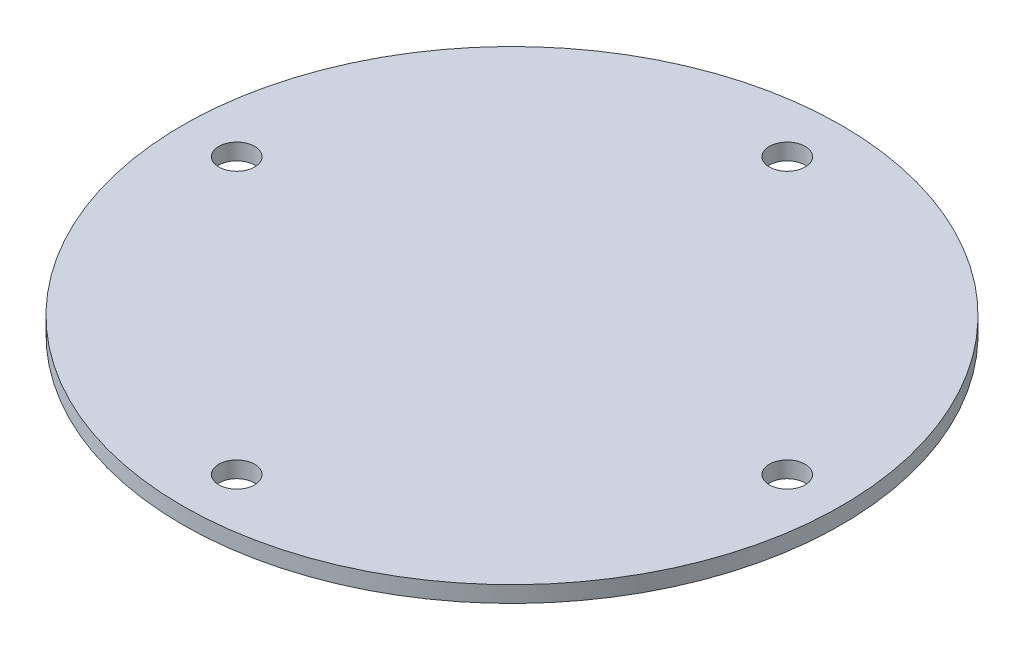
ISO-10303-21;
HEADER;
FILE_DESCRIPTION(('STEP AP214'),'2;1');
FILE_NAME('part.step','',(''),(''),'','','');
FILE_SCHEMA(('AUTOMOTIVE_DESIGN { 1 0 10303 214 1 1 1 1 }'));
ENDSEC;
DATA;
#1=APPLICATION_CONTEXT('core data for automotive mechanical design processes');
#2=APPLICATION_PROTOCOL_DEFINITION('international standard','automotive_design',2000,#1);
#3=PRODUCT_CONTEXT('',#1,'mechanical');
#4=PRODUCT('Part','Part','',(#3));
#5=PRODUCT_RELATED_PRODUCT_CATEGORY('part','',(#4));
#6=PRODUCT_DEFINITION_FORMATION('','',#4);
#7=PRODUCT_DEFINITION_CONTEXT('part definition',#1,'design');
#8=PRODUCT_DEFINITION('design','',#6,#7);
#9=PRODUCT_DEFINITION_SHAPE('','',#8);
#10=(LENGTH_UNIT() NAMED_UNIT(*) SI_UNIT(.MILLI.,.METRE.));
#11=(NAMED_UNIT(*) PLANE_ANGLE_UNIT() SI_UNIT($,.RADIAN.));
#12=(NAMED_UNIT(*) SI_UNIT($,.STERADIAN.) SOLID_ANGLE_UNIT());
#13=UNCERTAINTY_MEASURE_WITH_UNIT(LENGTH_MEASURE(1.E-05),#10,'distance_accuracy_value','');
#14=(GEOMETRIC_REPRESENTATION_CONTEXT(3) GLOBAL_UNCERTAINTY_ASSIGNED_CONTEXT((#13)) GLOBAL_UNIT_ASSIGNED_CONTEXT((#10,
#11,#12)) REPRESENTATION_CONTEXT('',''));
#15=CARTESIAN_POINT('',(0.,0.,0.));
#16=DIRECTION('',(0.,0.,1.));
#17=DIRECTION('',(1.,0.,0.));
#18=AXIS2_PLACEMENT_3D('',#15,#16,#17);
#19=CARTESIAN_POINT('',(0.,1.5,0.));
#20=DIRECTION('',(0.,-1.,0.));
#21=DIRECTION('',(0.,0.,-1.));
#22=AXIS2_PLACEMENT_3D('',#19,#20,#21);
#23=CYLINDRICAL_SURFACE('',#22,60.7);
#24=CARTESIAN_POINT('',(0.,1.5,0.));
#25=DIRECTION('',(0.,1.,0.));
#26=DIRECTION('',(0.,0.,1.));
#27=AXIS2_PLACEMENT_3D('',#24,#25,#26);
#28=CIRCLE('',#27,60.7);
#29=CARTESIAN_POINT('',(0.,1.5,60.7));
#30=VERTEX_POINT('',#29);
#31=EDGE_CURVE('E10',#30,#30,#28,.T.);
#32=ORIENTED_EDGE('',*,*,#31,.F.);
#33=EDGE_LOOP('',(#32));
#34=FACE_BOUND('',#33,.T.);
#35=CARTESIAN_POINT('',(0.,-1.5,0.));
#36=DIRECTION('',(0.,1.,0.));
#37=DIRECTION('',(0.,0.,1.));
#38=AXIS2_PLACEMENT_3D('',#35,#36,#37);
#39=CIRCLE('',#38,60.7);
#40=CARTESIAN_POINT('',(0.,-1.5,60.7));
#41=VERTEX_POINT('',#40);
#42=EDGE_CURVE('E38',#41,#41,#39,.T.);
#43=ORIENTED_EDGE('',*,*,#42,.T.);
#44=EDGE_LOOP('',(#43));
#45=FACE_BOUND('',#44,.T.);
#46=ADVANCED_FACE('F35',(#34,#45),#23,.T.);
#47=CARTESIAN_POINT('',(0.,1.5,0.));
#48=DIRECTION('',(0.,1.,0.));
#49=DIRECTION('',(0.,0.,1.));
#50=AXIS2_PLACEMENT_3D('',#47,#48,#49);
#51=PLANE('',#50);
#52=CARTESIAN_POINT('',(-1.77018103879347E-13,1.5,-50.7));
#53=DIRECTION('',(0.,1.,0.));
#54=DIRECTION('',(1.,0.,0.));
#55=AXIS2_PLACEMENT_3D('',#52,#53,#54);
#56=CIRCLE('',#55,3.3);
#57=CARTESIAN_POINT('',(3.29999999999982,1.5,-50.7));
#58=VERTEX_POINT('',#57);
#59=EDGE_CURVE('E52',#58,#58,#56,.T.);
#60=ORIENTED_EDGE('',*,*,#59,.F.);
#61=EDGE_LOOP('',(#60));
#62=FACE_BOUND('',#61,.T.);
#63=CARTESIAN_POINT('',(-50.7,1.5,0.));
#64=DIRECTION('',(0.,1.,0.));
#65=DIRECTION('',(0.,0.,-1.));
#66=AXIS2_PLACEMENT_3D('',#63,#64,#65);
#67=CIRCLE('',#66,3.3);
#68=CARTESIAN_POINT('',(-50.7,1.5,-3.3));
#69=VERTEX_POINT('',#68);
#70=EDGE_CURVE('E60',#69,#69,#67,.T.);
#71=ORIENTED_EDGE('',*,*,#70,.F.);
#72=EDGE_LOOP('',(#71));
#73=FACE_BOUND('',#72,.T.);
#74=CARTESIAN_POINT('',(5.31054311638041E-13,1.5,50.7));
#75=DIRECTION('',(0.,1.,0.));
#76=DIRECTION('',(-1.,0.,0.));
#77=AXIS2_PLACEMENT_3D('',#74,#75,#76);
#78=CIRCLE('',#77,3.3);
#79=CARTESIAN_POINT('',(-3.29999999999947,1.5,50.7));
#80=VERTEX_POINT('',#79);
#81=EDGE_CURVE('E53',#80,#80,#78,.T.);
#82=ORIENTED_EDGE('',*,*,#81,.F.);
#83=EDGE_LOOP('',(#82));
#84=FACE_BOUND('',#83,.T.);
#85=CARTESIAN_POINT('',(50.7,1.5,0.));
#86=DIRECTION('',(0.,1.,0.));
#87=DIRECTION('',(0.,0.,1.));
#88=AXIS2_PLACEMENT_3D('',#85,#86,#87);
#89=CIRCLE('',#88,3.3);
#90=CARTESIAN_POINT('',(50.7,1.5,3.3));
#91=VERTEX_POINT('',#90);
#92=EDGE_CURVE('E49',#91,#91,#89,.T.);
#93=ORIENTED_EDGE('',*,*,#92,.F.);
#94=EDGE_LOOP('',(#93));
#95=FACE_BOUND('',#94,.T.);
#96=ORIENTED_EDGE('',*,*,#31,.T.);
#97=EDGE_LOOP('',(#96));
#98=FACE_BOUND('',#97,.T.);
#99=ADVANCED_FACE('F81',(#62,#73,#84,#95,#98),#51,.T.);
#100=CARTESIAN_POINT('',(0.,-1.5,0.));
#101=DIRECTION('',(0.,1.,0.));
#102=DIRECTION('',(0.,0.,1.));
#103=AXIS2_PLACEMENT_3D('',#100,#101,#102);
#104=PLANE('',#103);
#105=CARTESIAN_POINT('',(-1.77018103879347E-13,-1.5,-50.7));
#106=DIRECTION('',(0.,1.,0.));
#107=DIRECTION('',(1.,0.,0.));
#108=AXIS2_PLACEMENT_3D('',#105,#106,#107);
#109=CIRCLE('',#108,3.3);
#110=CARTESIAN_POINT('',(3.29999999999982,-1.5,-50.7));
#111=VERTEX_POINT('',#110);
#112=EDGE_CURVE('E63',#111,#111,#109,.T.);
#113=ORIENTED_EDGE('',*,*,#112,.T.);
#114=EDGE_LOOP('',(#113));
#115=FACE_BOUND('',#114,.T.);
#116=CARTESIAN_POINT('',(-50.7,-1.5,0.));
#117=DIRECTION('',(0.,1.,0.));
#118=DIRECTION('',(0.,0.,-1.));
#119=AXIS2_PLACEMENT_3D('',#116,#117,#118);
#120=CIRCLE('',#119,3.3);
#121=CARTESIAN_POINT('',(-50.7,-1.5,-3.3));
#122=VERTEX_POINT('',#121);
#123=EDGE_CURVE('E56',#122,#122,#120,.T.);
#124=ORIENTED_EDGE('',*,*,#123,.T.);
#125=EDGE_LOOP('',(#124));
#126=FACE_BOUND('',#125,.T.);
#127=CARTESIAN_POINT('',(5.31054311638041E-13,-1.5,50.7));
#128=DIRECTION('',(0.,1.,0.));
#129=DIRECTION('',(-1.,0.,0.));
#130=AXIS2_PLACEMENT_3D('',#127,#128,#129);
#131=CIRCLE('',#130,3.3);
#132=CARTESIAN_POINT('',(-3.29999999999947,-1.5,50.7));
#133=VERTEX_POINT('',#132);
#134=EDGE_CURVE('E57',#133,#133,#131,.T.);
#135=ORIENTED_EDGE('',*,*,#134,.T.);
#136=EDGE_LOOP('',(#135));
#137=FACE_BOUND('',#136,.T.);
#138=CARTESIAN_POINT('',(50.7,-1.5,0.));
#139=DIRECTION('',(0.,1.,0.));
#140=DIRECTION('',(0.,0.,1.));
#141=AXIS2_PLACEMENT_3D('',#138,#139,#140);
#142=CIRCLE('',#141,3.3);
#143=CARTESIAN_POINT('',(50.7,-1.5,3.3));
#144=VERTEX_POINT('',#143);
#145=EDGE_CURVE('E45',#144,#144,#142,.T.);
#146=ORIENTED_EDGE('',*,*,#145,.T.);
#147=EDGE_LOOP('',(#146));
#148=FACE_BOUND('',#147,.T.);
#149=ORIENTED_EDGE('',*,*,#42,.F.);
#150=EDGE_LOOP('',(#149));
#151=FACE_BOUND('',#150,.T.);
#152=ADVANCED_FACE('F71',(#115,#126,#137,#148,#151),#104,.F.);
#153=CARTESIAN_POINT('',(50.7,1.5,0.));
#154=DIRECTION('',(0.,1.,0.));
#155=DIRECTION('',(0.,0.,1.));
#156=AXIS2_PLACEMENT_3D('',#153,#154,#155);
#157=CYLINDRICAL_SURFACE('',#156,3.3);
#158=ORIENTED_EDGE('',*,*,#145,.F.);
#159=EDGE_LOOP('',(#158));
#160=FACE_BOUND('',#159,.T.);
#161=ORIENTED_EDGE('',*,*,#92,.T.);
#162=EDGE_LOOP('',(#161));
#163=FACE_BOUND('',#162,.T.);
#164=ADVANCED_FACE('F91',(#160,#163),#157,.F.);
#165=CARTESIAN_POINT('',(5.31054311638041E-13,1.5,50.7));
#166=DIRECTION('',(0.,1.,0.));
#167=DIRECTION('',(-1.,0.,0.));
#168=AXIS2_PLACEMENT_3D('',#165,#166,#167);
#169=CYLINDRICAL_SURFACE('',#168,3.3);
#170=ORIENTED_EDGE('',*,*,#134,.F.);
#171=EDGE_LOOP('',(#170));
#172=FACE_BOUND('',#171,.T.);
#173=ORIENTED_EDGE('',*,*,#81,.T.);
#174=EDGE_LOOP('',(#173));
#175=FACE_BOUND('',#174,.T.);
#176=ADVANCED_FACE('F93',(#172,#175),#169,.F.);
#177=CARTESIAN_POINT('',(-50.7,1.5,0.));
#178=DIRECTION('',(0.,1.,0.));
#179=DIRECTION('',(0.,0.,-1.));
#180=AXIS2_PLACEMENT_3D('',#177,#178,#179);
#181=CYLINDRICAL_SURFACE('',#180,3.3);
#182=ORIENTED_EDGE('',*,*,#123,.F.);
#183=EDGE_LOOP('',(#182));
#184=FACE_BOUND('',#183,.T.);
#185=ORIENTED_EDGE('',*,*,#70,.T.);
#186=EDGE_LOOP('',(#185));
#187=FACE_BOUND('',#186,.T.);
#188=ADVANCED_FACE('F77',(#184,#187),#181,.F.);
#189=CARTESIAN_POINT('',(-1.77018103879347E-13,1.5,-50.7));
#190=DIRECTION('',(0.,1.,0.));
#191=DIRECTION('',(1.,0.,0.));
#192=AXIS2_PLACEMENT_3D('',#189,#190,#191);
#193=CYLINDRICAL_SURFACE('',#192,3.3);
#194=ORIENTED_EDGE('',*,*,#112,.F.);
#195=EDGE_LOOP('',(#194));
#196=FACE_BOUND('',#195,.T.);
#197=ORIENTED_EDGE('',*,*,#59,.T.);
#198=EDGE_LOOP('',(#197));
#199=FACE_BOUND('',#198,.T.);
#200=ADVANCED_FACE('F74',(#196,#199),#193,.F.);
#201=CLOSED_SHELL('',(#46,#99,#152,#164,#176,#188,#200));
#202=MANIFOLD_SOLID_BREP('B2',#201);
#203=ADVANCED_BREP_SHAPE_REPRESENTATION('',(#18,#202),#14);
#204=SHAPE_DEFINITION_REPRESENTATION(#9,#203);
ENDSEC;
END-ISO-10303-21;
